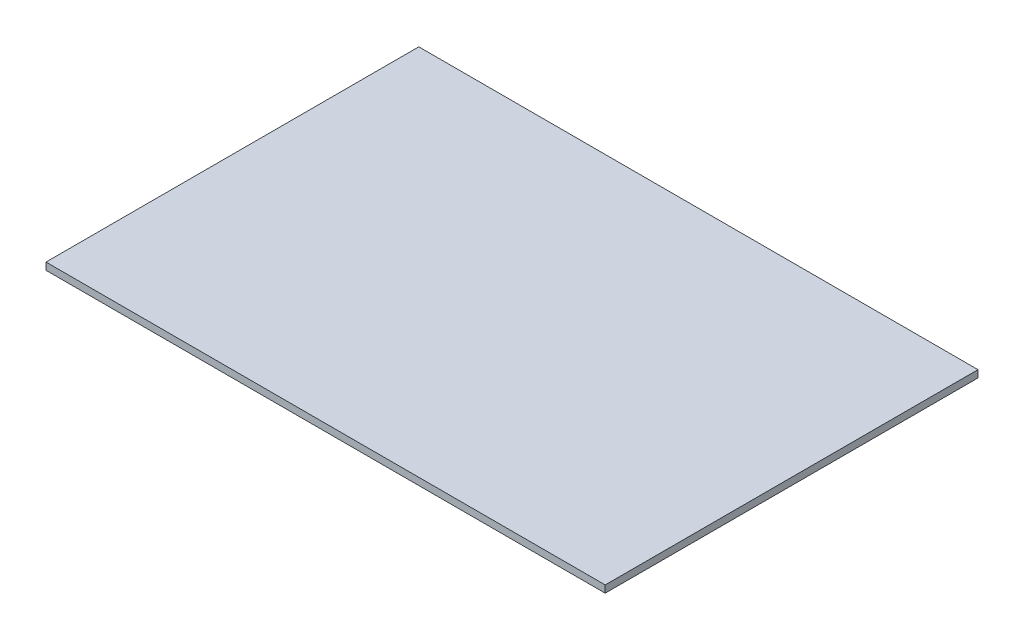
ISO-10303-21;
HEADER;
FILE_DESCRIPTION(('STEP AP214'),'2;1');
FILE_NAME('part.step','',(''),(''),'','','');
FILE_SCHEMA(('AUTOMOTIVE_DESIGN { 1 0 10303 214 1 1 1 1 }'));
ENDSEC;
DATA;
#1=APPLICATION_CONTEXT('core data for automotive mechanical design processes');
#2=APPLICATION_PROTOCOL_DEFINITION('international standard','automotive_design',2000,#1);
#3=PRODUCT_CONTEXT('',#1,'mechanical');
#4=PRODUCT('Part','Part','',(#3));
#5=PRODUCT_RELATED_PRODUCT_CATEGORY('part','',(#4));
#6=PRODUCT_DEFINITION_FORMATION('','',#4);
#7=PRODUCT_DEFINITION_CONTEXT('part definition',#1,'design');
#8=PRODUCT_DEFINITION('design','',#6,#7);
#9=PRODUCT_DEFINITION_SHAPE('','',#8);
#10=(LENGTH_UNIT() NAMED_UNIT(*) SI_UNIT(.MILLI.,.METRE.));
#11=(NAMED_UNIT(*) PLANE_ANGLE_UNIT() SI_UNIT($,.RADIAN.));
#12=(NAMED_UNIT(*) SI_UNIT($,.STERADIAN.) SOLID_ANGLE_UNIT());
#13=UNCERTAINTY_MEASURE_WITH_UNIT(LENGTH_MEASURE(1.E-05),#10,'distance_accuracy_value','');
#14=(GEOMETRIC_REPRESENTATION_CONTEXT(3) GLOBAL_UNCERTAINTY_ASSIGNED_CONTEXT((#13)) GLOBAL_UNIT_ASSIGNED_CONTEXT((#10,
#11,#12)) REPRESENTATION_CONTEXT('',''));
#15=CARTESIAN_POINT('',(0.,0.,0.));
#16=DIRECTION('',(0.,0.,1.));
#17=DIRECTION('',(1.,0.,0.));
#18=AXIS2_PLACEMENT_3D('',#15,#16,#17);
#19=CARTESIAN_POINT('',(0.,10.,0.));
#20=DIRECTION('',(-1.,0.,0.));
#21=DIRECTION('',(0.,0.,1.));
#22=AXIS2_PLACEMENT_3D('',#19,#20,#21);
#23=PLANE('',#22);
#24=DIRECTION('',(0.,0.,-1.));
#25=VECTOR('',#24,1.);
#26=CARTESIAN_POINT('',(0.,0.,0.));
#27=LINE('',#26,#25);
#28=CARTESIAN_POINT('',(0.,0.,0.));
#29=VERTEX_POINT('',#28);
#30=CARTESIAN_POINT('',(0.,0.,-520.));
#31=VERTEX_POINT('',#30);
#32=EDGE_CURVE('E98',#29,#31,#27,.T.);
#33=ORIENTED_EDGE('',*,*,#32,.T.);
#34=DIRECTION('',(0.,-1.,0.));
#35=VECTOR('',#34,1.);
#36=CARTESIAN_POINT('',(0.,10.,-520.));
#37=LINE('',#36,#35);
#38=CARTESIAN_POINT('',(0.,10.,-520.));
#39=VERTEX_POINT('',#38);
#40=EDGE_CURVE('E11',#39,#31,#37,.T.);
#41=ORIENTED_EDGE('',*,*,#40,.F.);
#42=DIRECTION('',(0.,0.,-1.));
#43=VECTOR('',#42,1.);
#44=CARTESIAN_POINT('',(0.,10.,0.));
#45=LINE('',#44,#43);
#46=CARTESIAN_POINT('',(0.,10.,0.));
#47=VERTEX_POINT('',#46);
#48=EDGE_CURVE('E86',#47,#39,#45,.T.);
#49=ORIENTED_EDGE('',*,*,#48,.F.);
#50=DIRECTION('',(0.,-1.,0.));
#51=VECTOR('',#50,1.);
#52=CARTESIAN_POINT('',(0.,10.,0.));
#53=LINE('',#52,#51);
#54=EDGE_CURVE('E94',#47,#29,#53,.T.);
#55=ORIENTED_EDGE('',*,*,#54,.T.);
#56=EDGE_LOOP('',(#33,#41,#49,#55));
#57=FACE_BOUND('',#56,.T.);
#58=ADVANCED_FACE('F35',(#57),#23,.F.);
#59=CARTESIAN_POINT('',(0.,10.,-520.));
#60=DIRECTION('',(0.,0.,1.));
#61=DIRECTION('',(1.,0.,0.));
#62=AXIS2_PLACEMENT_3D('',#59,#60,#61);
#63=PLANE('',#62);
#64=DIRECTION('',(-1.,0.,0.));
#65=VECTOR('',#64,1.);
#66=CARTESIAN_POINT('',(0.,0.,-520.));
#67=LINE('',#66,#65);
#68=CARTESIAN_POINT('',(-780.,0.,-520.));
#69=VERTEX_POINT('',#68);
#70=EDGE_CURVE('E90',#31,#69,#67,.T.);
#71=ORIENTED_EDGE('',*,*,#70,.T.);
#72=DIRECTION('',(0.,-1.,0.));
#73=VECTOR('',#72,1.);
#74=CARTESIAN_POINT('',(-780.,10.,-520.));
#75=LINE('',#74,#73);
#76=CARTESIAN_POINT('',(-780.,10.,-520.));
#77=VERTEX_POINT('',#76);
#78=EDGE_CURVE('E43',#77,#69,#75,.T.);
#79=ORIENTED_EDGE('',*,*,#78,.F.);
#80=DIRECTION('',(-1.,0.,0.));
#81=VECTOR('',#80,1.);
#82=CARTESIAN_POINT('',(0.,10.,-520.));
#83=LINE('',#82,#81);
#84=EDGE_CURVE('E81',#39,#77,#83,.T.);
#85=ORIENTED_EDGE('',*,*,#84,.F.);
#86=ORIENTED_EDGE('',*,*,#40,.T.);
#87=EDGE_LOOP('',(#71,#79,#85,#86));
#88=FACE_BOUND('',#87,.T.);
#89=ADVANCED_FACE('F89',(#88),#63,.F.);
#90=CARTESIAN_POINT('',(-780.,10.,0.));
#91=DIRECTION('',(1.,0.,0.));
#92=DIRECTION('',(0.,0.,-1.));
#93=AXIS2_PLACEMENT_3D('',#90,#91,#92);
#94=PLANE('',#93);
#95=DIRECTION('',(0.,0.,1.));
#96=VECTOR('',#95,1.);
#97=CARTESIAN_POINT('',(-780.,0.,0.));
#98=LINE('',#97,#96);
#99=CARTESIAN_POINT('',(-780.,0.,0.));
#100=VERTEX_POINT('',#99);
#101=EDGE_CURVE('E68',#69,#100,#98,.T.);
#102=ORIENTED_EDGE('',*,*,#101,.T.);
#103=DIRECTION('',(0.,-1.,0.));
#104=VECTOR('',#103,1.);
#105=CARTESIAN_POINT('',(-780.,10.,0.));
#106=LINE('',#105,#104);
#107=CARTESIAN_POINT('',(-780.,10.,0.));
#108=VERTEX_POINT('',#107);
#109=EDGE_CURVE('E91',#108,#100,#106,.T.);
#110=ORIENTED_EDGE('',*,*,#109,.F.);
#111=DIRECTION('',(0.,0.,1.));
#112=VECTOR('',#111,1.);
#113=CARTESIAN_POINT('',(-780.,10.,0.));
#114=LINE('',#113,#112);
#115=EDGE_CURVE('E84',#77,#108,#114,.T.);
#116=ORIENTED_EDGE('',*,*,#115,.F.);
#117=ORIENTED_EDGE('',*,*,#78,.T.);
#118=EDGE_LOOP('',(#102,#110,#116,#117));
#119=FACE_BOUND('',#118,.T.);
#120=ADVANCED_FACE('F92',(#119),#94,.F.);
#121=CARTESIAN_POINT('',(0.,10.,0.));
#122=DIRECTION('',(0.,0.,-1.));
#123=DIRECTION('',(-1.,0.,0.));
#124=AXIS2_PLACEMENT_3D('',#121,#122,#123);
#125=PLANE('',#124);
#126=DIRECTION('',(1.,0.,0.));
#127=VECTOR('',#126,1.);
#128=CARTESIAN_POINT('',(0.,0.,0.));
#129=LINE('',#128,#127);
#130=EDGE_CURVE('E74',#100,#29,#129,.T.);
#131=ORIENTED_EDGE('',*,*,#130,.T.);
#132=ORIENTED_EDGE('',*,*,#54,.F.);
#133=DIRECTION('',(1.,0.,0.));
#134=VECTOR('',#133,1.);
#135=CARTESIAN_POINT('',(0.,10.,0.));
#136=LINE('',#135,#134);
#137=EDGE_CURVE('E51',#108,#47,#136,.T.);
#138=ORIENTED_EDGE('',*,*,#137,.F.);
#139=ORIENTED_EDGE('',*,*,#109,.T.);
#140=EDGE_LOOP('',(#131,#132,#138,#139));
#141=FACE_BOUND('',#140,.T.);
#142=ADVANCED_FACE('F105',(#141),#125,.F.);
#143=CARTESIAN_POINT('',(0.,10.,0.));
#144=DIRECTION('',(0.,1.,0.));
#145=DIRECTION('',(0.,0.,1.));
#146=AXIS2_PLACEMENT_3D('',#143,#144,#145);
#147=PLANE('',#146);
#148=ORIENTED_EDGE('',*,*,#48,.T.);
#149=ORIENTED_EDGE('',*,*,#84,.T.);
#150=ORIENTED_EDGE('',*,*,#115,.T.);
#151=ORIENTED_EDGE('',*,*,#137,.T.);
#152=EDGE_LOOP('',(#148,#149,#150,#151));
#153=FACE_BOUND('',#152,.T.);
#154=ADVANCED_FACE('F82',(#153),#147,.T.);
#155=CARTESIAN_POINT('',(0.,0.,0.));
#156=DIRECTION('',(0.,1.,0.));
#157=DIRECTION('',(0.,0.,1.));
#158=AXIS2_PLACEMENT_3D('',#155,#156,#157);
#159=PLANE('',#158);
#160=ORIENTED_EDGE('',*,*,#32,.F.);
#161=ORIENTED_EDGE('',*,*,#130,.F.);
#162=ORIENTED_EDGE('',*,*,#101,.F.);
#163=ORIENTED_EDGE('',*,*,#70,.F.);
#164=EDGE_LOOP('',(#160,#161,#162,#163));
#165=FACE_BOUND('',#164,.T.);
#166=ADVANCED_FACE('F108',(#165),#159,.F.);
#167=CLOSED_SHELL('',(#58,#89,#120,#142,#154,#166));
#168=MANIFOLD_SOLID_BREP('B2',#167);
#169=ADVANCED_BREP_SHAPE_REPRESENTATION('',(#18,#168),#14);
#170=SHAPE_DEFINITION_REPRESENTATION(#9,#169);
ENDSEC;
END-ISO-10303-21;
